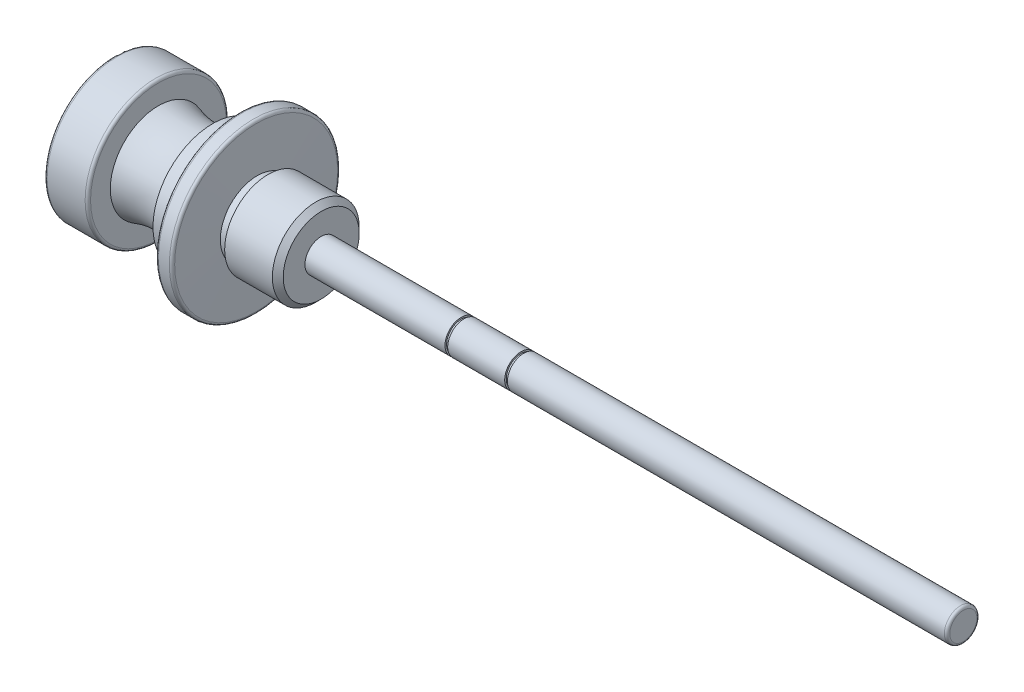
ISO-10303-21;
HEADER;
FILE_DESCRIPTION(('STEP AP214'),'2;1');
FILE_NAME('part.step','',(''),(''),'','','');
FILE_SCHEMA(('AUTOMOTIVE_DESIGN { 1 0 10303 214 1 1 1 1 }'));
ENDSEC;
DATA;
#1=APPLICATION_CONTEXT('core data for automotive mechanical design processes');
#2=APPLICATION_PROTOCOL_DEFINITION('international standard','automotive_design',2000,#1);
#3=PRODUCT_CONTEXT('',#1,'mechanical');
#4=PRODUCT('Part','Part','',(#3));
#5=PRODUCT_RELATED_PRODUCT_CATEGORY('part','',(#4));
#6=PRODUCT_DEFINITION_FORMATION('','',#4);
#7=PRODUCT_DEFINITION_CONTEXT('part definition',#1,'design');
#8=PRODUCT_DEFINITION('design','',#6,#7);
#9=PRODUCT_DEFINITION_SHAPE('','',#8);
#10=(LENGTH_UNIT() NAMED_UNIT(*) SI_UNIT(.MILLI.,.METRE.));
#11=(NAMED_UNIT(*) PLANE_ANGLE_UNIT() SI_UNIT($,.RADIAN.));
#12=(NAMED_UNIT(*) SI_UNIT($,.STERADIAN.) SOLID_ANGLE_UNIT());
#13=UNCERTAINTY_MEASURE_WITH_UNIT(LENGTH_MEASURE(1.E-05),#10,'distance_accuracy_value','');
#14=(GEOMETRIC_REPRESENTATION_CONTEXT(3) GLOBAL_UNCERTAINTY_ASSIGNED_CONTEXT((#13)) GLOBAL_UNIT_ASSIGNED_CONTEXT((#10,
#11,#12)) REPRESENTATION_CONTEXT('',''));
#15=CARTESIAN_POINT('',(0.,0.,0.));
#16=DIRECTION('',(0.,0.,1.));
#17=DIRECTION('',(1.,0.,0.));
#18=AXIS2_PLACEMENT_3D('',#15,#16,#17);
#19=CARTESIAN_POINT('',(0.,0.,0.));
#20=DIRECTION('',(-1.,0.,0.));
#21=DIRECTION('',(0.,0.,1.));
#22=AXIS2_PLACEMENT_3D('',#19,#20,#21);
#23=CYLINDRICAL_SURFACE('',#22,3.);
#24=CARTESIAN_POINT('',(20.,0.,0.));
#25=DIRECTION('',(-1.,0.,0.));
#26=DIRECTION('',(0.,0.,1.));
#27=AXIS2_PLACEMENT_3D('',#24,#25,#26);
#28=CIRCLE('',#27,3.);
#29=CARTESIAN_POINT('',(20.,0.,3.));
#30=VERTEX_POINT('',#29);
#31=EDGE_CURVE('E90',#30,#30,#28,.T.);
#32=ORIENTED_EDGE('',*,*,#31,.F.);
#33=EDGE_LOOP('',(#32));
#34=FACE_BOUND('',#33,.T.);
#35=CARTESIAN_POINT('',(45.8006686131611,0.,0.));
#36=DIRECTION('',(1.,0.,0.));
#37=DIRECTION('',(0.,0.,-1.));
#38=AXIS2_PLACEMENT_3D('',#35,#36,#37);
#39=CIRCLE('',#38,3.);
#40=CARTESIAN_POINT('',(45.8006686131611,0.,-3.));
#41=VERTEX_POINT('',#40);
#42=EDGE_CURVE('E125',#41,#41,#39,.T.);
#43=ORIENTED_EDGE('',*,*,#42,.F.);
#44=EDGE_LOOP('',(#43));
#45=FACE_BOUND('',#44,.T.);
#46=ADVANCED_FACE('F43',(#34,#45),#23,.T.);
#47=CARTESIAN_POINT('',(20.,0.,0.));
#48=DIRECTION('',(1.,0.,0.));
#49=DIRECTION('',(0.,0.,-1.));
#50=AXIS2_PLACEMENT_3D('',#47,#48,#49);
#51=PLANE('',#50);
#52=CARTESIAN_POINT('',(20.,0.,0.));
#53=DIRECTION('',(1.,0.,0.));
#54=DIRECTION('',(0.,0.,-1.));
#55=AXIS2_PLACEMENT_3D('',#52,#53,#54);
#56=CIRCLE('',#55,6.99999999999999);
#57=CARTESIAN_POINT('',(20.,0.,-6.99999999999999));
#58=VERTEX_POINT('',#57);
#59=EDGE_CURVE('E82',#58,#58,#56,.T.);
#60=ORIENTED_EDGE('',*,*,#59,.T.);
#61=EDGE_LOOP('',(#60));
#62=FACE_BOUND('',#61,.T.);
#63=ORIENTED_EDGE('',*,*,#31,.T.);
#64=EDGE_LOOP('',(#63));
#65=FACE_BOUND('',#64,.T.);
#66=ADVANCED_FACE('F153',(#62,#65),#51,.T.);
#67=CARTESIAN_POINT('',(0.,0.,0.));
#68=DIRECTION('',(-1.,0.,0.));
#69=DIRECTION('',(0.,0.,1.));
#70=AXIS2_PLACEMENT_3D('',#67,#68,#69);
#71=CYLINDRICAL_SURFACE('',#70,8.);
#72=CARTESIAN_POINT('',(19.,0.,0.));
#73=DIRECTION('',(1.,0.,0.));
#74=DIRECTION('',(0.,0.,-1.));
#75=AXIS2_PLACEMENT_3D('',#72,#73,#74);
#76=CIRCLE('',#75,8.);
#77=CARTESIAN_POINT('',(19.,0.,-8.));
#78=VERTEX_POINT('',#77);
#79=EDGE_CURVE('E81',#78,#78,#76,.F.);
#80=ORIENTED_EDGE('',*,*,#79,.T.);
#81=EDGE_LOOP('',(#80));
#82=FACE_BOUND('',#81,.T.);
#83=CARTESIAN_POINT('',(10.2092653547601,0.,0.));
#84=DIRECTION('',(-1.,0.,0.));
#85=DIRECTION('',(0.,0.,1.));
#86=AXIS2_PLACEMENT_3D('',#83,#84,#85);
#87=CIRCLE('',#86,8.);
#88=CARTESIAN_POINT('',(10.2092653547601,0.,8.));
#89=VERTEX_POINT('',#88);
#90=EDGE_CURVE('E87',#89,#89,#87,.T.);
#91=ORIENTED_EDGE('',*,*,#90,.F.);
#92=EDGE_LOOP('',(#91));
#93=FACE_BOUND('',#92,.T.);
#94=ADVANCED_FACE('F157',(#82,#93),#71,.T.);
#95=CARTESIAN_POINT('',(10.2092653547601,0.,0.));
#96=DIRECTION('',(-1.,0.,0.));
#97=DIRECTION('',(0.,0.,1.));
#98=AXIS2_PLACEMENT_3D('',#95,#96,#97);
#99=PLANE('',#98);
#100=ORIENTED_EDGE('',*,*,#90,.T.);
#101=EDGE_LOOP('',(#100));
#102=FACE_BOUND('',#101,.T.);
#103=CARTESIAN_POINT('',(10.2092653547601,0.,0.));
#104=DIRECTION('',(-1.,0.,0.));
#105=DIRECTION('',(0.,0.,1.));
#106=AXIS2_PLACEMENT_3D('',#103,#104,#105);
#107=CIRCLE('',#106,6.8);
#108=CARTESIAN_POINT('',(10.2092653547601,0.,6.8));
#109=VERTEX_POINT('',#108);
#110=EDGE_CURVE('E95',#109,#109,#107,.T.);
#111=ORIENTED_EDGE('',*,*,#110,.F.);
#112=EDGE_LOOP('',(#111));
#113=FACE_BOUND('',#112,.T.);
#114=ADVANCED_FACE('F235',(#102,#113),#99,.T.);
#115=CARTESIAN_POINT('',(0.,0.,0.));
#116=DIRECTION('',(-1.,0.,0.));
#117=DIRECTION('',(0.,0.,1.));
#118=AXIS2_PLACEMENT_3D('',#115,#116,#117);
#119=CYLINDRICAL_SURFACE('',#118,6.8);
#120=ORIENTED_EDGE('',*,*,#110,.T.);
#121=EDGE_LOOP('',(#120));
#122=FACE_BOUND('',#121,.T.);
#123=CARTESIAN_POINT('',(8.2092653547601,0.,0.));
#124=DIRECTION('',(-1.,0.,0.));
#125=DIRECTION('',(0.,0.,1.));
#126=AXIS2_PLACEMENT_3D('',#123,#124,#125);
#127=CIRCLE('',#126,6.8);
#128=CARTESIAN_POINT('',(8.2092653547601,0.,6.8));
#129=VERTEX_POINT('',#128);
#130=EDGE_CURVE('E98',#129,#129,#127,.T.);
#131=ORIENTED_EDGE('',*,*,#130,.F.);
#132=EDGE_LOOP('',(#131));
#133=FACE_BOUND('',#132,.T.);
#134=ADVANCED_FACE('F226',(#122,#133),#119,.T.);
#135=CARTESIAN_POINT('',(8.,0.,0.));
#136=DIRECTION('',(-1.,0.,0.));
#137=DIRECTION('',(0.,0.,1.));
#138=AXIS2_PLACEMENT_3D('',#135,#136,#137);
#139=CONICAL_SURFACE('',#138,15.5,1.54674747501074);
#140=CARTESIAN_POINT('',(8.01173754300825,0.,0.));
#141=DIRECTION('',(1.,0.,0.));
#142=DIRECTION('',(0.,0.,-1.));
#143=AXIS2_PLACEMENT_3D('',#140,#141,#142);
#144=CIRCLE('',#143,15.0120232668766);
#145=CARTESIAN_POINT('',(8.01173754300825,0.,-15.0120232668766));
#146=VERTEX_POINT('',#145);
#147=EDGE_CURVE('E71',#146,#146,#144,.T.);
#148=ORIENTED_EDGE('',*,*,#147,.T.);
#149=EDGE_LOOP('',(#148));
#150=FACE_BOUND('',#149,.T.);
#151=ORIENTED_EDGE('',*,*,#130,.T.);
#152=EDGE_LOOP('',(#151));
#153=FACE_BOUND('',#152,.T.);
#154=ADVANCED_FACE('F223',(#150,#153),#139,.T.);
#155=CARTESIAN_POINT('',(0.,0.,0.));
#156=DIRECTION('',(-1.,0.,0.));
#157=DIRECTION('',(0.,0.,1.));
#158=AXIS2_PLACEMENT_3D('',#155,#156,#157);
#159=CYLINDRICAL_SURFACE('',#158,15.5);
#160=CARTESIAN_POINT('',(7.51188212285797,0.,0.));
#161=DIRECTION('',(1.,0.,0.));
#162=DIRECTION('',(0.,0.,-1.));
#163=AXIS2_PLACEMENT_3D('',#160,#161,#162);
#164=CIRCLE('',#163,15.5);
#165=CARTESIAN_POINT('',(7.51188212285797,0.,-15.5));
#166=VERTEX_POINT('',#165);
#167=EDGE_CURVE('E72',#166,#166,#164,.F.);
#168=ORIENTED_EDGE('',*,*,#167,.T.);
#169=EDGE_LOOP('',(#168));
#170=FACE_BOUND('',#169,.T.);
#171=CARTESIAN_POINT('',(5.5,0.,0.));
#172=DIRECTION('',(-1.,0.,0.));
#173=DIRECTION('',(0.,0.,1.));
#174=AXIS2_PLACEMENT_3D('',#171,#172,#173);
#175=CIRCLE('',#174,15.5);
#176=CARTESIAN_POINT('',(5.5,0.,15.5));
#177=VERTEX_POINT('',#176);
#178=EDGE_CURVE('E76',#177,#177,#175,.F.);
#179=ORIENTED_EDGE('',*,*,#178,.T.);
#180=EDGE_LOOP('',(#179));
#181=FACE_BOUND('',#180,.T.);
#182=ADVANCED_FACE('F217',(#170,#181),#159,.T.);
#183=CARTESIAN_POINT('',(5.,0.,0.));
#184=DIRECTION('',(-1.,0.,0.));
#185=DIRECTION('',(0.,0.,1.));
#186=AXIS2_PLACEMENT_3D('',#183,#184,#185);
#187=PLANE('',#186);
#188=CARTESIAN_POINT('',(5.,0.,0.));
#189=DIRECTION('',(-1.,0.,0.));
#190=DIRECTION('',(0.,0.,1.));
#191=AXIS2_PLACEMENT_3D('',#188,#189,#190);
#192=CIRCLE('',#191,15.);
#193=CARTESIAN_POINT('',(5.,0.,15.));
#194=VERTEX_POINT('',#193);
#195=EDGE_CURVE('E69',#194,#194,#192,.T.);
#196=ORIENTED_EDGE('',*,*,#195,.T.);
#197=EDGE_LOOP('',(#196));
#198=FACE_BOUND('',#197,.T.);
#199=CARTESIAN_POINT('',(5.,0.,0.));
#200=DIRECTION('',(-1.,0.,0.));
#201=DIRECTION('',(0.,0.,1.));
#202=AXIS2_PLACEMENT_3D('',#199,#200,#201);
#203=CIRCLE('',#202,11.);
#204=CARTESIAN_POINT('',(5.,0.,11.));
#205=VERTEX_POINT('',#204);
#206=EDGE_CURVE('E100',#205,#205,#203,.T.);
#207=ORIENTED_EDGE('',*,*,#206,.F.);
#208=EDGE_LOOP('',(#207));
#209=FACE_BOUND('',#208,.T.);
#210=ADVANCED_FACE('F218',(#198,#209),#187,.T.);
#211=CARTESIAN_POINT('',(0.,0.,0.));
#212=DIRECTION('',(-1.,0.,0.));
#213=DIRECTION('',(0.,0.,1.));
#214=AXIS2_PLACEMENT_3D('',#211,#212,#213);
#215=CYLINDRICAL_SURFACE('',#214,11.);
#216=ORIENTED_EDGE('',*,*,#206,.T.);
#217=EDGE_LOOP('',(#216));
#218=FACE_BOUND('',#217,.T.);
#219=CARTESIAN_POINT('',(0.,0.,0.));
#220=DIRECTION('',(-1.,0.,0.));
#221=DIRECTION('',(0.,0.,1.));
#222=AXIS2_PLACEMENT_3D('',#219,#220,#221);
#223=CIRCLE('',#222,11.);
#224=CARTESIAN_POINT('',(0.,0.,11.));
#225=VERTEX_POINT('',#224);
#226=EDGE_CURVE('E105',#225,#225,#223,.T.);
#227=ORIENTED_EDGE('',*,*,#226,.F.);
#228=EDGE_LOOP('',(#227));
#229=FACE_BOUND('',#228,.T.);
#230=ADVANCED_FACE('F215',(#218,#229),#215,.T.);
#231=CARTESIAN_POINT('',(0.,0.,0.));
#232=DIRECTION('',(-1.,0.,0.));
#233=DIRECTION('',(0.,0.,1.));
#234=AXIS2_PLACEMENT_3D('',#231,#232,#233);
#235=PLANE('',#234);
#236=ORIENTED_EDGE('',*,*,#226,.T.);
#237=EDGE_LOOP('',(#236));
#238=FACE_BOUND('',#237,.T.);
#239=CARTESIAN_POINT('',(0.,0.,0.));
#240=DIRECTION('',(-1.,0.,0.));
#241=DIRECTION('',(0.,0.,1.));
#242=AXIS2_PLACEMENT_3D('',#239,#240,#241);
#243=CIRCLE('',#242,8.85786437626905);
#244=CARTESIAN_POINT('',(0.,0.,8.85786437626905));
#245=VERTEX_POINT('',#244);
#246=EDGE_CURVE('E102',#245,#245,#243,.T.);
#247=ORIENTED_EDGE('',*,*,#246,.F.);
#248=EDGE_LOOP('',(#247));
#249=FACE_BOUND('',#248,.T.);
#250=ADVANCED_FACE('F206',(#238,#249),#235,.T.);
#251=CARTESIAN_POINT('',(-5.,0.,0.));
#252=DIRECTION('',(-1.,0.,0.));
#253=DIRECTION('',(0.,0.,1.));
#254=AXIS2_PLACEMENT_3D('',#251,#252,#253);
#255=TOROIDAL_SURFACE('',#254,23.,15.);
#256=ORIENTED_EDGE('',*,*,#246,.T.);
#257=EDGE_LOOP('',(#256));
#258=FACE_BOUND('',#257,.T.);
#259=CARTESIAN_POINT('',(-10.,0.,0.));
#260=DIRECTION('',(-1.,0.,0.));
#261=DIRECTION('',(0.,0.,1.));
#262=AXIS2_PLACEMENT_3D('',#259,#260,#261);
#263=CIRCLE('',#262,8.85786437626905);
#264=CARTESIAN_POINT('',(-10.,0.,8.85786437626905));
#265=VERTEX_POINT('',#264);
#266=EDGE_CURVE('E108',#265,#265,#263,.T.);
#267=ORIENTED_EDGE('',*,*,#266,.F.);
#268=EDGE_LOOP('',(#267));
#269=FACE_BOUND('',#268,.T.);
#270=ADVANCED_FACE('F203',(#258,#269),#255,.F.);
#271=CARTESIAN_POINT('',(-10.,0.,0.));
#272=DIRECTION('',(-1.,0.,0.));
#273=DIRECTION('',(0.,0.,1.));
#274=AXIS2_PLACEMENT_3D('',#271,#272,#273);
#275=PLANE('',#274);
#276=CARTESIAN_POINT('',(-10.,0.,0.));
#277=DIRECTION('',(-1.,0.,0.));
#278=DIRECTION('',(0.,0.,1.));
#279=AXIS2_PLACEMENT_3D('',#276,#277,#278);
#280=CIRCLE('',#279,12.5);
#281=CARTESIAN_POINT('',(-10.,0.,12.5));
#282=VERTEX_POINT('',#281);
#283=EDGE_CURVE('E59',#282,#282,#280,.F.);
#284=ORIENTED_EDGE('',*,*,#283,.T.);
#285=EDGE_LOOP('',(#284));
#286=FACE_BOUND('',#285,.T.);
#287=ORIENTED_EDGE('',*,*,#266,.T.);
#288=EDGE_LOOP('',(#287));
#289=FACE_BOUND('',#288,.T.);
#290=ADVANCED_FACE('F197',(#286,#289),#275,.F.);
#291=CARTESIAN_POINT('',(0.,0.,0.));
#292=DIRECTION('',(-1.,0.,0.));
#293=DIRECTION('',(0.,0.,1.));
#294=AXIS2_PLACEMENT_3D('',#291,#292,#293);
#295=CYLINDRICAL_SURFACE('',#294,13.);
#296=CARTESIAN_POINT('',(-10.5,0.,0.));
#297=DIRECTION('',(-1.,0.,0.));
#298=DIRECTION('',(0.,0.,1.));
#299=AXIS2_PLACEMENT_3D('',#296,#297,#298);
#300=CIRCLE('',#299,13.);
#301=CARTESIAN_POINT('',(-10.5,0.,13.));
#302=VERTEX_POINT('',#301);
#303=EDGE_CURVE('E64',#302,#302,#300,.T.);
#304=ORIENTED_EDGE('',*,*,#303,.T.);
#305=EDGE_LOOP('',(#304));
#306=FACE_BOUND('',#305,.T.);
#307=CARTESIAN_POINT('',(-17.5,0.,0.));
#308=DIRECTION('',(1.,0.,0.));
#309=DIRECTION('',(0.,0.,-1.));
#310=AXIS2_PLACEMENT_3D('',#307,#308,#309);
#311=CIRCLE('',#310,13.);
#312=CARTESIAN_POINT('',(-17.5,0.,-13.));
#313=VERTEX_POINT('',#312);
#314=EDGE_CURVE('E68',#313,#313,#311,.T.);
#315=ORIENTED_EDGE('',*,*,#314,.T.);
#316=EDGE_LOOP('',(#315));
#317=FACE_BOUND('',#316,.T.);
#318=ADVANCED_FACE('F198',(#306,#317),#295,.T.);
#319=CARTESIAN_POINT('',(-18.,0.,0.));
#320=DIRECTION('',(1.,0.,0.));
#321=DIRECTION('',(0.,0.,-1.));
#322=AXIS2_PLACEMENT_3D('',#319,#320,#321);
#323=PLANE('',#322);
#324=CARTESIAN_POINT('',(-18.,0.,0.));
#325=DIRECTION('',(1.,0.,0.));
#326=DIRECTION('',(0.,0.,-1.));
#327=AXIS2_PLACEMENT_3D('',#324,#325,#326);
#328=CIRCLE('',#327,12.5);
#329=CARTESIAN_POINT('',(-18.,0.,-12.5));
#330=VERTEX_POINT('',#329);
#331=EDGE_CURVE('E53',#330,#330,#328,.F.);
#332=ORIENTED_EDGE('',*,*,#331,.T.);
#333=EDGE_LOOP('',(#332));
#334=FACE_BOUND('',#333,.T.);
#335=CARTESIAN_POINT('',(-18.,0.,0.));
#336=DIRECTION('',(-1.,0.,0.));
#337=DIRECTION('',(0.,0.,1.));
#338=AXIS2_PLACEMENT_3D('',#335,#336,#337);
#339=CIRCLE('',#338,2.);
#340=CARTESIAN_POINT('',(-18.,0.,2.));
#341=VERTEX_POINT('',#340);
#342=EDGE_CURVE('E111',#341,#341,#339,.T.);
#343=ORIENTED_EDGE('',*,*,#342,.F.);
#344=EDGE_LOOP('',(#343));
#345=FACE_BOUND('',#344,.T.);
#346=ADVANCED_FACE('F194',(#334,#345),#323,.F.);
#347=CARTESIAN_POINT('',(-18.,0.,0.));
#348=DIRECTION('',(-1.,0.,0.));
#349=DIRECTION('',(0.,1.,0.));
#350=AXIS2_PLACEMENT_3D('',#347,#348,#349);
#351=SPHERICAL_SURFACE('',#350,2.);
#352=ORIENTED_EDGE('',*,*,#342,.T.);
#353=EDGE_LOOP('',(#352));
#354=FACE_BOUND('',#353,.T.);
#355=ADVANCED_FACE('F188',(#354),#351,.T.);
#356=CARTESIAN_POINT('',(19.,0.,0.));
#357=DIRECTION('',(-1.,0.,0.));
#358=DIRECTION('',(0.,0.,1.));
#359=AXIS2_PLACEMENT_3D('',#356,#357,#358);
#360=CONICAL_SURFACE('',#359,8.,0.785398163397448);
#361=ORIENTED_EDGE('',*,*,#59,.F.);
#362=EDGE_LOOP('',(#361));
#363=FACE_BOUND('',#362,.T.);
#364=ORIENTED_EDGE('',*,*,#79,.F.);
#365=EDGE_LOOP('',(#364));
#366=FACE_BOUND('',#365,.T.);
#367=ADVANCED_FACE('F147',(#363,#366),#360,.T.);
#368=CARTESIAN_POINT('',(45.8006686131611,0.,0.));
#369=DIRECTION('',(1.,0.,0.));
#370=DIRECTION('',(0.,0.,-1.));
#371=AXIS2_PLACEMENT_3D('',#368,#369,#370);
#372=PLANE('',#371);
#373=CARTESIAN_POINT('',(45.8006686131611,0.,0.));
#374=DIRECTION('',(1.,0.,0.));
#375=DIRECTION('',(0.,0.,-1.));
#376=AXIS2_PLACEMENT_3D('',#373,#374,#375);
#377=CIRCLE('',#376,2.7);
#378=CARTESIAN_POINT('',(45.8006686131611,0.,-2.7));
#379=VERTEX_POINT('',#378);
#380=EDGE_CURVE('E128',#379,#379,#377,.T.);
#381=ORIENTED_EDGE('',*,*,#380,.F.);
#382=EDGE_LOOP('',(#381));
#383=FACE_BOUND('',#382,.T.);
#384=ORIENTED_EDGE('',*,*,#42,.T.);
#385=EDGE_LOOP('',(#384));
#386=FACE_BOUND('',#385,.T.);
#387=ADVANCED_FACE('F145',(#383,#386),#372,.T.);
#388=CARTESIAN_POINT('',(46.3006686131611,0.,0.));
#389=DIRECTION('',(1.,0.,0.));
#390=DIRECTION('',(0.,0.,-1.));
#391=AXIS2_PLACEMENT_3D('',#388,#389,#390);
#392=PLANE('',#391);
#393=CARTESIAN_POINT('',(46.3006686131611,0.,0.));
#394=DIRECTION('',(1.,0.,0.));
#395=DIRECTION('',(0.,0.,-1.));
#396=AXIS2_PLACEMENT_3D('',#393,#394,#395);
#397=CIRCLE('',#396,2.7);
#398=CARTESIAN_POINT('',(46.3006686131611,0.,-2.7));
#399=VERTEX_POINT('',#398);
#400=EDGE_CURVE('E131',#399,#399,#397,.T.);
#401=ORIENTED_EDGE('',*,*,#400,.T.);
#402=EDGE_LOOP('',(#401));
#403=FACE_BOUND('',#402,.T.);
#404=CARTESIAN_POINT('',(46.3006686131611,0.,0.));
#405=DIRECTION('',(1.,0.,0.));
#406=DIRECTION('',(0.,0.,-1.));
#407=AXIS2_PLACEMENT_3D('',#404,#405,#406);
#408=CIRCLE('',#407,3.);
#409=CARTESIAN_POINT('',(46.3006686131611,0.,-3.));
#410=VERTEX_POINT('',#409);
#411=EDGE_CURVE('E130',#410,#410,#408,.T.);
#412=ORIENTED_EDGE('',*,*,#411,.F.);
#413=EDGE_LOOP('',(#412));
#414=FACE_BOUND('',#413,.T.);
#415=ADVANCED_FACE('F143',(#403,#414),#392,.F.);
#416=CARTESIAN_POINT('',(45.8006686131611,0.,0.));
#417=DIRECTION('',(1.,0.,0.));
#418=DIRECTION('',(0.,0.,-1.));
#419=AXIS2_PLACEMENT_3D('',#416,#417,#418);
#420=CYLINDRICAL_SURFACE('',#419,2.7);
#421=ORIENTED_EDGE('',*,*,#380,.T.);
#422=EDGE_LOOP('',(#421));
#423=FACE_BOUND('',#422,.T.);
#424=ORIENTED_EDGE('',*,*,#400,.F.);
#425=EDGE_LOOP('',(#424));
#426=FACE_BOUND('',#425,.T.);
#427=ADVANCED_FACE('F138',(#423,#426),#420,.T.);
#428=CARTESIAN_POINT('',(138.300668613161,0.,0.));
#429=DIRECTION('',(1.,0.,0.));
#430=DIRECTION('',(0.,0.,-1.));
#431=AXIS2_PLACEMENT_3D('',#428,#429,#430);
#432=PLANE('',#431);
#433=CARTESIAN_POINT('',(138.300668613161,0.,0.));
#434=DIRECTION('',(1.,0.,0.));
#435=DIRECTION('',(0.,0.,-1.));
#436=AXIS2_PLACEMENT_3D('',#433,#434,#435);
#437=CIRCLE('',#436,2.5);
#438=CARTESIAN_POINT('',(138.300668613161,0.,-2.5));
#439=VERTEX_POINT('',#438);
#440=EDGE_CURVE('E10',#439,#439,#437,.T.);
#441=ORIENTED_EDGE('',*,*,#440,.T.);
#442=EDGE_LOOP('',(#441));
#443=FACE_BOUND('',#442,.T.);
#444=ADVANCED_FACE('F171',(#443),#432,.T.);
#445=CARTESIAN_POINT('',(137.800668613161,0.,0.));
#446=DIRECTION('',(1.,0.,0.));
#447=DIRECTION('',(0.,0.,-1.));
#448=AXIS2_PLACEMENT_3D('',#445,#446,#447);
#449=CIRCLE('',#448,3.);
#450=CARTESIAN_POINT('',(137.800668613161,0.,-3.));
#451=VERTEX_POINT('',#450);
#452=EDGE_CURVE('E49',#451,#451,#449,.F.);
#453=ORIENTED_EDGE('',*,*,#452,.T.);
#454=EDGE_LOOP('',(#453));
#455=FACE_BOUND('',#454,.T.);
#456=CARTESIAN_POINT('',(57.3006686131611,0.,0.));
#457=DIRECTION('',(1.,0.,0.));
#458=DIRECTION('',(0.,0.,-1.));
#459=AXIS2_PLACEMENT_3D('',#456,#457,#458);
#460=CIRCLE('',#459,3.);
#461=CARTESIAN_POINT('',(57.3006686131611,0.,-3.));
#462=VERTEX_POINT('',#461);
#463=EDGE_CURVE('E114',#462,#462,#460,.T.);
#464=ORIENTED_EDGE('',*,*,#463,.T.);
#465=EDGE_LOOP('',(#464));
#466=FACE_BOUND('',#465,.T.);
#467=ADVANCED_FACE('F152',(#455,#466),#23,.T.);
#468=CARTESIAN_POINT('',(57.3006686131611,0.,0.));
#469=DIRECTION('',(1.,0.,0.));
#470=DIRECTION('',(0.,0.,-1.));
#471=AXIS2_PLACEMENT_3D('',#468,#469,#470);
#472=PLANE('',#471);
#473=CARTESIAN_POINT('',(57.3006686131611,0.,0.));
#474=DIRECTION('',(1.,0.,0.));
#475=DIRECTION('',(0.,0.,-1.));
#476=AXIS2_PLACEMENT_3D('',#473,#474,#475);
#477=CIRCLE('',#476,2.7);
#478=CARTESIAN_POINT('',(57.3006686131611,0.,-2.7));
#479=VERTEX_POINT('',#478);
#480=EDGE_CURVE('E118',#479,#479,#477,.T.);
#481=ORIENTED_EDGE('',*,*,#480,.T.);
#482=EDGE_LOOP('',(#481));
#483=FACE_BOUND('',#482,.T.);
#484=ORIENTED_EDGE('',*,*,#463,.F.);
#485=EDGE_LOOP('',(#484));
#486=FACE_BOUND('',#485,.T.);
#487=ADVANCED_FACE('F167',(#483,#486),#472,.F.);
#488=CARTESIAN_POINT('',(56.8006686131611,0.,0.));
#489=DIRECTION('',(1.,0.,0.));
#490=DIRECTION('',(0.,0.,-1.));
#491=AXIS2_PLACEMENT_3D('',#488,#489,#490);
#492=CYLINDRICAL_SURFACE('',#491,2.7);
#493=CARTESIAN_POINT('',(56.8006686131611,0.,0.));
#494=DIRECTION('',(1.,0.,0.));
#495=DIRECTION('',(0.,0.,-1.));
#496=AXIS2_PLACEMENT_3D('',#493,#494,#495);
#497=CIRCLE('',#496,2.7);
#498=CARTESIAN_POINT('',(56.8006686131611,0.,-2.7));
#499=VERTEX_POINT('',#498);
#500=EDGE_CURVE('E117',#499,#499,#497,.T.);
#501=ORIENTED_EDGE('',*,*,#500,.T.);
#502=EDGE_LOOP('',(#501));
#503=FACE_BOUND('',#502,.T.);
#504=ORIENTED_EDGE('',*,*,#480,.F.);
#505=EDGE_LOOP('',(#504));
#506=FACE_BOUND('',#505,.T.);
#507=ADVANCED_FACE('F176',(#503,#506),#492,.T.);
#508=CARTESIAN_POINT('',(56.8006686131611,0.,0.));
#509=DIRECTION('',(1.,0.,0.));
#510=DIRECTION('',(0.,0.,-1.));
#511=AXIS2_PLACEMENT_3D('',#508,#509,#510);
#512=PLANE('',#511);
#513=ORIENTED_EDGE('',*,*,#500,.F.);
#514=EDGE_LOOP('',(#513));
#515=FACE_BOUND('',#514,.T.);
#516=CARTESIAN_POINT('',(56.8006686131611,0.,0.));
#517=DIRECTION('',(1.,0.,0.));
#518=DIRECTION('',(0.,0.,-1.));
#519=AXIS2_PLACEMENT_3D('',#516,#517,#518);
#520=CIRCLE('',#519,3.);
#521=CARTESIAN_POINT('',(56.8006686131611,0.,-3.));
#522=VERTEX_POINT('',#521);
#523=EDGE_CURVE('E112',#522,#522,#520,.T.);
#524=ORIENTED_EDGE('',*,*,#523,.T.);
#525=EDGE_LOOP('',(#524));
#526=FACE_BOUND('',#525,.T.);
#527=ADVANCED_FACE('F170',(#515,#526),#512,.T.);
#528=ORIENTED_EDGE('',*,*,#411,.T.);
#529=EDGE_LOOP('',(#528));
#530=FACE_BOUND('',#529,.T.);
#531=ORIENTED_EDGE('',*,*,#523,.F.);
#532=EDGE_LOOP('',(#531));
#533=FACE_BOUND('',#532,.T.);
#534=ADVANCED_FACE('F154',(#530,#533),#23,.T.);
#535=CARTESIAN_POINT('',(7.51188212285797,0.,0.));
#536=DIRECTION('',(1.,0.,0.));
#537=DIRECTION('',(0.,0.,-1.));
#538=AXIS2_PLACEMENT_3D('',#535,#536,#537);
#539=TOROIDAL_SURFACE('',#538,15.,0.5);
#540=ORIENTED_EDGE('',*,*,#147,.F.);
#541=EDGE_LOOP('',(#540));
#542=FACE_BOUND('',#541,.T.);
#543=ORIENTED_EDGE('',*,*,#167,.F.);
#544=EDGE_LOOP('',(#543));
#545=FACE_BOUND('',#544,.T.);
#546=ADVANCED_FACE('F168',(#542,#545),#539,.T.);
#547=CARTESIAN_POINT('',(5.5,0.,0.));
#548=DIRECTION('',(-1.,0.,0.));
#549=DIRECTION('',(0.,0.,1.));
#550=AXIS2_PLACEMENT_3D('',#547,#548,#549);
#551=TOROIDAL_SURFACE('',#550,15.,0.5);
#552=ORIENTED_EDGE('',*,*,#178,.F.);
#553=EDGE_LOOP('',(#552));
#554=FACE_BOUND('',#553,.T.);
#555=ORIENTED_EDGE('',*,*,#195,.F.);
#556=EDGE_LOOP('',(#555));
#557=FACE_BOUND('',#556,.T.);
#558=ADVANCED_FACE('F263',(#554,#557),#551,.T.);
#559=CARTESIAN_POINT('',(-10.5,0.,0.));
#560=DIRECTION('',(-1.,0.,0.));
#561=DIRECTION('',(0.,0.,1.));
#562=AXIS2_PLACEMENT_3D('',#559,#560,#561);
#563=TOROIDAL_SURFACE('',#562,12.5,0.5);
#564=ORIENTED_EDGE('',*,*,#283,.F.);
#565=EDGE_LOOP('',(#564));
#566=FACE_BOUND('',#565,.T.);
#567=ORIENTED_EDGE('',*,*,#303,.F.);
#568=EDGE_LOOP('',(#567));
#569=FACE_BOUND('',#568,.T.);
#570=ADVANCED_FACE('F262',(#566,#569),#563,.T.);
#571=CARTESIAN_POINT('',(-17.5,0.,0.));
#572=DIRECTION('',(1.,0.,0.));
#573=DIRECTION('',(0.,0.,-1.));
#574=AXIS2_PLACEMENT_3D('',#571,#572,#573);
#575=TOROIDAL_SURFACE('',#574,12.5,0.5);
#576=ORIENTED_EDGE('',*,*,#314,.F.);
#577=EDGE_LOOP('',(#576));
#578=FACE_BOUND('',#577,.T.);
#579=ORIENTED_EDGE('',*,*,#331,.F.);
#580=EDGE_LOOP('',(#579));
#581=FACE_BOUND('',#580,.T.);
#582=ADVANCED_FACE('F270',(#578,#581),#575,.T.);
#583=CARTESIAN_POINT('',(137.800668613161,0.,0.));
#584=DIRECTION('',(1.,0.,0.));
#585=DIRECTION('',(0.,0.,-1.));
#586=AXIS2_PLACEMENT_3D('',#583,#584,#585);
#587=TOROIDAL_SURFACE('',#586,2.5,0.5);
#588=ORIENTED_EDGE('',*,*,#440,.F.);
#589=EDGE_LOOP('',(#588));
#590=FACE_BOUND('',#589,.T.);
#591=ORIENTED_EDGE('',*,*,#452,.F.);
#592=EDGE_LOOP('',(#591));
#593=FACE_BOUND('',#592,.T.);
#594=ADVANCED_FACE('F44',(#590,#593),#587,.T.);
#595=CLOSED_SHELL('',(#46,#66,#94,#114,#134,#154,#182,#210,#230,#250,#270,#290,#318,#346,#355,
#367,#387,#415,#427,#444,#467,#487,#507,#527,#534,#546,#558,#570,#582,#594));
#596=MANIFOLD_SOLID_BREP('B2',#595);
#597=ADVANCED_BREP_SHAPE_REPRESENTATION('',(#18,#596),#14);
#598=SHAPE_DEFINITION_REPRESENTATION(#9,#597);
ENDSEC;
END-ISO-10303-21;
